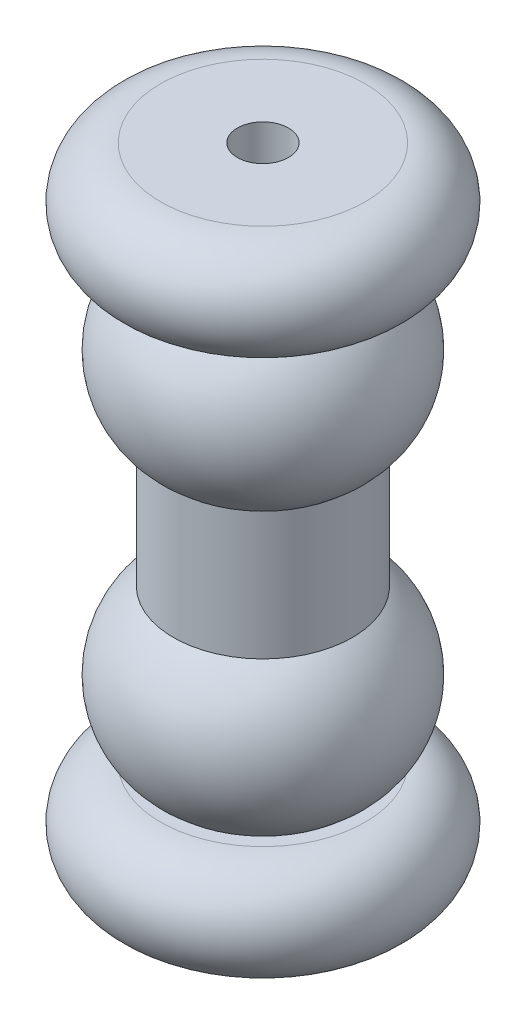
ISO-10303-21;
HEADER;
FILE_DESCRIPTION(('STEP AP214'),'2;1');
FILE_NAME('part.step','',(''),(''),'','','');
FILE_SCHEMA(('AUTOMOTIVE_DESIGN { 1 0 10303 214 1 1 1 1 }'));
ENDSEC;
DATA;
#1=APPLICATION_CONTEXT('core data for automotive mechanical design processes');
#2=APPLICATION_PROTOCOL_DEFINITION('international standard','automotive_design',2000,#1);
#3=PRODUCT_CONTEXT('',#1,'mechanical');
#4=PRODUCT('Part','Part','',(#3));
#5=PRODUCT_RELATED_PRODUCT_CATEGORY('part','',(#4));
#6=PRODUCT_DEFINITION_FORMATION('','',#4);
#7=PRODUCT_DEFINITION_CONTEXT('part definition',#1,'design');
#8=PRODUCT_DEFINITION('design','',#6,#7);
#9=PRODUCT_DEFINITION_SHAPE('','',#8);
#10=(LENGTH_UNIT() NAMED_UNIT(*) SI_UNIT(.MILLI.,.METRE.));
#11=(NAMED_UNIT(*) PLANE_ANGLE_UNIT() SI_UNIT($,.RADIAN.));
#12=(NAMED_UNIT(*) SI_UNIT($,.STERADIAN.) SOLID_ANGLE_UNIT());
#13=UNCERTAINTY_MEASURE_WITH_UNIT(LENGTH_MEASURE(1.E-05),#10,'distance_accuracy_value','');
#14=(GEOMETRIC_REPRESENTATION_CONTEXT(3) GLOBAL_UNCERTAINTY_ASSIGNED_CONTEXT((#13)) GLOBAL_UNIT_ASSIGNED_CONTEXT((#10,
#11,#12)) REPRESENTATION_CONTEXT('',''));
#15=CARTESIAN_POINT('',(0.,0.,0.));
#16=DIRECTION('',(0.,0.,1.));
#17=DIRECTION('',(1.,0.,0.));
#18=AXIS2_PLACEMENT_3D('',#15,#16,#17);
#19=CARTESIAN_POINT('',(0.,0.,0.));
#20=DIRECTION('',(0.,-1.,0.));
#21=DIRECTION('',(0.,0.,-1.));
#22=AXIS2_PLACEMENT_3D('',#19,#20,#21);
#23=PLANE('',#22);
#24=CARTESIAN_POINT('',(0.,0.,0.));
#25=DIRECTION('',(0.,-1.,0.));
#26=DIRECTION('',(0.,0.,-1.));
#27=AXIS2_PLACEMENT_3D('',#24,#25,#26);
#28=CIRCLE('',#27,4.);
#29=CARTESIAN_POINT('',(0.,0.,-4.));
#30=VERTEX_POINT('',#29);
#31=EDGE_CURVE('E10',#30,#30,#28,.T.);
#32=ORIENTED_EDGE('',*,*,#31,.T.);
#33=EDGE_LOOP('',(#32));
#34=FACE_BOUND('',#33,.T.);
#35=CARTESIAN_POINT('',(0.,0.,0.));
#36=DIRECTION('',(0.,-1.,0.));
#37=DIRECTION('',(0.,0.,-1.));
#38=AXIS2_PLACEMENT_3D('',#35,#36,#37);
#39=CIRCLE('',#38,1.);
#40=CARTESIAN_POINT('',(0.,0.,-1.));
#41=VERTEX_POINT('',#40);
#42=EDGE_CURVE('E67',#41,#41,#39,.T.);
#43=ORIENTED_EDGE('',*,*,#42,.F.);
#44=EDGE_LOOP('',(#43));
#45=FACE_BOUND('',#44,.T.);
#46=ADVANCED_FACE('F33',(#34,#45),#23,.T.);
#47=CARTESIAN_POINT('',(0.,2.,0.));
#48=DIRECTION('',(0.,-1.,0.));
#49=DIRECTION('',(0.,0.,-1.));
#50=AXIS2_PLACEMENT_3D('',#47,#48,#49);
#51=TOROIDAL_SURFACE('',#50,4.,2.);
#52=CARTESIAN_POINT('',(0.,4.,0.));
#53=DIRECTION('',(0.,-1.,0.));
#54=DIRECTION('',(0.,0.,-1.));
#55=AXIS2_PLACEMENT_3D('',#52,#53,#54);
#56=CIRCLE('',#55,4.);
#57=CARTESIAN_POINT('',(0.,4.,-4.));
#58=VERTEX_POINT('',#57);
#59=EDGE_CURVE('E39',#58,#58,#56,.T.);
#60=ORIENTED_EDGE('',*,*,#59,.T.);
#61=EDGE_LOOP('',(#60));
#62=FACE_BOUND('',#61,.T.);
#63=ORIENTED_EDGE('',*,*,#31,.F.);
#64=EDGE_LOOP('',(#63));
#65=FACE_BOUND('',#64,.T.);
#66=ADVANCED_FACE('F75',(#62,#65),#51,.T.);
#67=CARTESIAN_POINT('',(0.,4.,0.));
#68=DIRECTION('',(0.,1.,0.));
#69=DIRECTION('',(0.,0.,1.));
#70=AXIS2_PLACEMENT_3D('',#67,#68,#69);
#71=PLANE('',#70);
#72=CARTESIAN_POINT('',(0.,4.,0.));
#73=DIRECTION('',(0.,-1.,0.));
#74=DIRECTION('',(0.,0.,-1.));
#75=AXIS2_PLACEMENT_3D('',#72,#73,#74);
#76=CIRCLE('',#75,3.5);
#77=CARTESIAN_POINT('',(0.,4.,-3.5));
#78=VERTEX_POINT('',#77);
#79=EDGE_CURVE('E43',#78,#78,#76,.T.);
#80=ORIENTED_EDGE('',*,*,#79,.T.);
#81=EDGE_LOOP('',(#80));
#82=FACE_BOUND('',#81,.T.);
#83=ORIENTED_EDGE('',*,*,#59,.F.);
#84=EDGE_LOOP('',(#83));
#85=FACE_BOUND('',#84,.T.);
#86=ADVANCED_FACE('F79',(#82,#85),#71,.T.);
#87=CARTESIAN_POINT('',(0.,7.,0.));
#88=DIRECTION('',(0.,-1.,0.));
#89=DIRECTION('',(0.,0.,-1.));
#90=AXIS2_PLACEMENT_3D('',#87,#88,#89);
#91=DEGENERATE_TOROIDAL_SURFACE('',#90,1.25,3.75,.T.);
#92=CARTESIAN_POINT('',(0.,10.,0.));
#93=DIRECTION('',(0.,-1.,0.));
#94=DIRECTION('',(0.,0.,-1.));
#95=AXIS2_PLACEMENT_3D('',#92,#93,#94);
#96=CIRCLE('',#95,3.5);
#97=CARTESIAN_POINT('',(0.,10.,-3.5));
#98=VERTEX_POINT('',#97);
#99=EDGE_CURVE('E47',#98,#98,#96,.T.);
#100=ORIENTED_EDGE('',*,*,#99,.T.);
#101=EDGE_LOOP('',(#100));
#102=FACE_BOUND('',#101,.T.);
#103=ORIENTED_EDGE('',*,*,#79,.F.);
#104=EDGE_LOOP('',(#103));
#105=FACE_BOUND('',#104,.T.);
#106=ADVANCED_FACE('F83',(#102,#105),#91,.T.);
#107=CARTESIAN_POINT('',(0.,0.,0.));
#108=DIRECTION('',(0.,-1.,0.));
#109=DIRECTION('',(0.,0.,-1.));
#110=AXIS2_PLACEMENT_3D('',#107,#108,#109);
#111=CYLINDRICAL_SURFACE('',#110,3.5);
#112=ORIENTED_EDGE('',*,*,#99,.F.);
#113=EDGE_LOOP('',(#112));
#114=FACE_BOUND('',#113,.T.);
#115=CARTESIAN_POINT('',(0.,15.,0.));
#116=DIRECTION('',(0.,-1.,0.));
#117=DIRECTION('',(0.,0.,-1.));
#118=AXIS2_PLACEMENT_3D('',#115,#116,#117);
#119=CIRCLE('',#118,3.5);
#120=CARTESIAN_POINT('',(0.,15.,-3.5));
#121=VERTEX_POINT('',#120);
#122=EDGE_CURVE('E52',#121,#121,#119,.T.);
#123=ORIENTED_EDGE('',*,*,#122,.T.);
#124=EDGE_LOOP('',(#123));
#125=FACE_BOUND('',#124,.T.);
#126=ADVANCED_FACE('F90',(#114,#125),#111,.T.);
#127=CARTESIAN_POINT('',(0.,18.,0.));
#128=DIRECTION('',(0.,-1.,0.));
#129=DIRECTION('',(0.,0.,-1.));
#130=AXIS2_PLACEMENT_3D('',#127,#128,#129);
#131=DEGENERATE_TOROIDAL_SURFACE('',#130,1.25,3.75,.T.);
#132=ORIENTED_EDGE('',*,*,#122,.F.);
#133=EDGE_LOOP('',(#132));
#134=FACE_BOUND('',#133,.T.);
#135=CARTESIAN_POINT('',(0.,21.,0.));
#136=DIRECTION('',(0.,-1.,0.));
#137=DIRECTION('',(0.,0.,-1.));
#138=AXIS2_PLACEMENT_3D('',#135,#136,#137);
#139=CIRCLE('',#138,3.5);
#140=CARTESIAN_POINT('',(0.,21.,-3.5));
#141=VERTEX_POINT('',#140);
#142=EDGE_CURVE('E55',#141,#141,#139,.T.);
#143=ORIENTED_EDGE('',*,*,#142,.T.);
#144=EDGE_LOOP('',(#143));
#145=FACE_BOUND('',#144,.T.);
#146=ADVANCED_FACE('F94',(#134,#145),#131,.T.);
#147=CARTESIAN_POINT('',(0.,21.,0.));
#148=DIRECTION('',(0.,1.,0.));
#149=DIRECTION('',(0.,0.,1.));
#150=AXIS2_PLACEMENT_3D('',#147,#148,#149);
#151=PLANE('',#150);
#152=ORIENTED_EDGE('',*,*,#142,.F.);
#153=EDGE_LOOP('',(#152));
#154=FACE_BOUND('',#153,.T.);
#155=CARTESIAN_POINT('',(0.,21.,0.));
#156=DIRECTION('',(0.,-1.,0.));
#157=DIRECTION('',(0.,0.,-1.));
#158=AXIS2_PLACEMENT_3D('',#155,#156,#157);
#159=CIRCLE('',#158,4.);
#160=CARTESIAN_POINT('',(0.,21.,-4.));
#161=VERTEX_POINT('',#160);
#162=EDGE_CURVE('E58',#161,#161,#159,.T.);
#163=ORIENTED_EDGE('',*,*,#162,.T.);
#164=EDGE_LOOP('',(#163));
#165=FACE_BOUND('',#164,.T.);
#166=ADVANCED_FACE('F98',(#154,#165),#151,.F.);
#167=CARTESIAN_POINT('',(0.,23.,0.));
#168=DIRECTION('',(0.,-1.,0.));
#169=DIRECTION('',(0.,0.,-1.));
#170=AXIS2_PLACEMENT_3D('',#167,#168,#169);
#171=TOROIDAL_SURFACE('',#170,4.,2.);
#172=ORIENTED_EDGE('',*,*,#162,.F.);
#173=EDGE_LOOP('',(#172));
#174=FACE_BOUND('',#173,.T.);
#175=CARTESIAN_POINT('',(0.,25.,0.));
#176=DIRECTION('',(0.,-1.,0.));
#177=DIRECTION('',(0.,0.,-1.));
#178=AXIS2_PLACEMENT_3D('',#175,#176,#177);
#179=CIRCLE('',#178,4.);
#180=CARTESIAN_POINT('',(0.,25.,-4.));
#181=VERTEX_POINT('',#180);
#182=EDGE_CURVE('E61',#181,#181,#179,.T.);
#183=ORIENTED_EDGE('',*,*,#182,.T.);
#184=EDGE_LOOP('',(#183));
#185=FACE_BOUND('',#184,.T.);
#186=ADVANCED_FACE('F102',(#174,#185),#171,.T.);
#187=CARTESIAN_POINT('',(0.,25.,0.));
#188=DIRECTION('',(0.,-1.,0.));
#189=DIRECTION('',(0.,0.,-1.));
#190=AXIS2_PLACEMENT_3D('',#187,#188,#189);
#191=PLANE('',#190);
#192=ORIENTED_EDGE('',*,*,#182,.F.);
#193=EDGE_LOOP('',(#192));
#194=FACE_BOUND('',#193,.T.);
#195=CARTESIAN_POINT('',(0.,25.,0.));
#196=DIRECTION('',(0.,-1.,0.));
#197=DIRECTION('',(0.,0.,-1.));
#198=AXIS2_PLACEMENT_3D('',#195,#196,#197);
#199=CIRCLE('',#198,1.);
#200=CARTESIAN_POINT('',(0.,25.,-1.));
#201=VERTEX_POINT('',#200);
#202=EDGE_CURVE('E64',#201,#201,#199,.T.);
#203=ORIENTED_EDGE('',*,*,#202,.T.);
#204=EDGE_LOOP('',(#203));
#205=FACE_BOUND('',#204,.T.);
#206=ADVANCED_FACE('F106',(#194,#205),#191,.F.);
#207=CARTESIAN_POINT('',(0.,0.,0.));
#208=DIRECTION('',(0.,-1.,0.));
#209=DIRECTION('',(0.,0.,-1.));
#210=AXIS2_PLACEMENT_3D('',#207,#208,#209);
#211=CYLINDRICAL_SURFACE('',#210,1.);
#212=ORIENTED_EDGE('',*,*,#42,.T.);
#213=EDGE_LOOP('',(#212));
#214=FACE_BOUND('',#213,.T.);
#215=ORIENTED_EDGE('',*,*,#202,.F.);
#216=EDGE_LOOP('',(#215));
#217=FACE_BOUND('',#216,.T.);
#218=ADVANCED_FACE('F71',(#214,#217),#211,.F.);
#219=CLOSED_SHELL('',(#46,#66,#86,#106,#126,#146,#166,#186,#206,#218));
#220=MANIFOLD_SOLID_BREP('B2',#219);
#221=ADVANCED_BREP_SHAPE_REPRESENTATION('',(#18,#220),#14);
#222=SHAPE_DEFINITION_REPRESENTATION(#9,#221);
ENDSEC;
END-ISO-10303-21;
